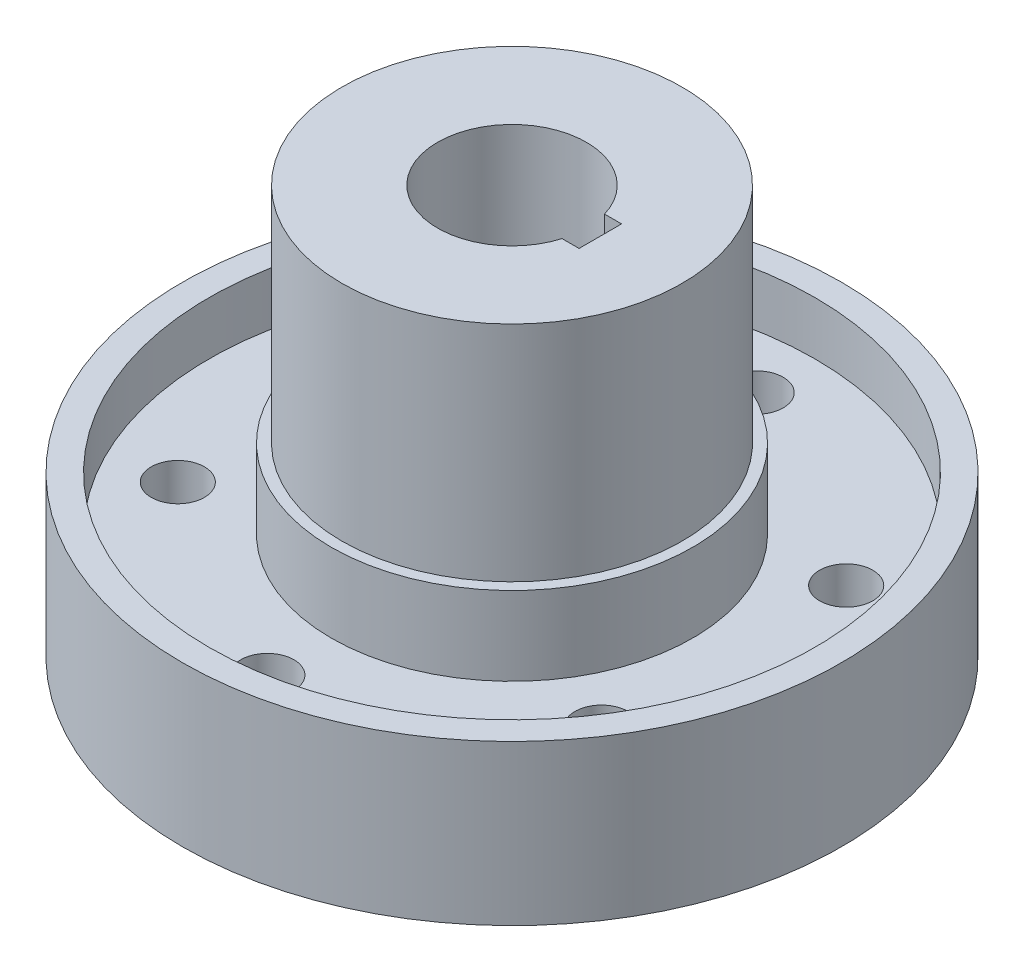
ISO-10303-21;
HEADER;
FILE_DESCRIPTION(('STEP AP214'),'2;1');
FILE_NAME('part.step','',(''),(''),'','','');
FILE_SCHEMA(('AUTOMOTIVE_DESIGN { 1 0 10303 214 1 1 1 1 }'));
ENDSEC;
DATA;
#1=APPLICATION_CONTEXT('core data for automotive mechanical design processes');
#2=APPLICATION_PROTOCOL_DEFINITION('international standard','automotive_design',2000,#1);
#3=PRODUCT_CONTEXT('',#1,'mechanical');
#4=PRODUCT('Part','Part','',(#3));
#5=PRODUCT_RELATED_PRODUCT_CATEGORY('part','',(#4));
#6=PRODUCT_DEFINITION_FORMATION('','',#4);
#7=PRODUCT_DEFINITION_CONTEXT('part definition',#1,'design');
#8=PRODUCT_DEFINITION('design','',#6,#7);
#9=PRODUCT_DEFINITION_SHAPE('','',#8);
#10=(LENGTH_UNIT() NAMED_UNIT(*) SI_UNIT(.MILLI.,.METRE.));
#11=(NAMED_UNIT(*) PLANE_ANGLE_UNIT() SI_UNIT($,.RADIAN.));
#12=(NAMED_UNIT(*) SI_UNIT($,.STERADIAN.) SOLID_ANGLE_UNIT());
#13=UNCERTAINTY_MEASURE_WITH_UNIT(LENGTH_MEASURE(1.E-05),#10,'distance_accuracy_value','');
#14=(GEOMETRIC_REPRESENTATION_CONTEXT(3) GLOBAL_UNCERTAINTY_ASSIGNED_CONTEXT((#13)) GLOBAL_UNIT_ASSIGNED_CONTEXT((#10,
#11,#12)) REPRESENTATION_CONTEXT('',''));
#15=CARTESIAN_POINT('',(0.,0.,0.));
#16=DIRECTION('',(0.,0.,1.));
#17=DIRECTION('',(1.,0.,0.));
#18=AXIS2_PLACEMENT_3D('',#15,#16,#17);
#19=CARTESIAN_POINT('',(0.,0.,0.));
#20=DIRECTION('',(0.,1.,0.));
#21=DIRECTION('',(0.,0.,1.));
#22=AXIS2_PLACEMENT_3D('',#19,#20,#21);
#23=CYLINDRICAL_SURFACE('',#22,35.);
#24=CARTESIAN_POINT('',(0.,53.,0.));
#25=DIRECTION('',(0.,-1.,0.));
#26=DIRECTION('',(0.,0.,-1.));
#27=AXIS2_PLACEMENT_3D('',#24,#25,#26);
#28=CIRCLE('',#27,35.);
#29=CARTESIAN_POINT('',(33.5410196624969,53.,-10.));
#30=VERTEX_POINT('',#29);
#31=CARTESIAN_POINT('',(33.5410196624969,53.,10.));
#32=VERTEX_POINT('',#31);
#33=EDGE_CURVE('E56',#30,#32,#28,.F.);
#34=ORIENTED_EDGE('',*,*,#33,.F.);
#35=DIRECTION('',(0.,1.,0.));
#36=VECTOR('',#35,1.);
#37=CARTESIAN_POINT('',(33.5410196624969,0.,-10.));
#38=LINE('',#37,#36);
#39=CARTESIAN_POINT('',(33.5410196624969,192.,-10.));
#40=VERTEX_POINT('',#39);
#41=EDGE_CURVE('E103',#30,#40,#38,.T.);
#42=ORIENTED_EDGE('',*,*,#41,.T.);
#43=CARTESIAN_POINT('',(0.,192.,0.));
#44=DIRECTION('',(0.,1.,0.));
#45=DIRECTION('',(0.,0.,1.));
#46=AXIS2_PLACEMENT_3D('',#43,#44,#45);
#47=CIRCLE('',#46,35.);
#48=CARTESIAN_POINT('',(33.5410196624969,192.,10.));
#49=VERTEX_POINT('',#48);
#50=EDGE_CURVE('E152',#40,#49,#47,.T.);
#51=ORIENTED_EDGE('',*,*,#50,.T.);
#52=DIRECTION('',(0.,1.,0.));
#53=VECTOR('',#52,1.);
#54=CARTESIAN_POINT('',(33.5410196624969,0.,10.));
#55=LINE('',#54,#53);
#56=EDGE_CURVE('E63',#32,#49,#55,.T.);
#57=ORIENTED_EDGE('',*,*,#56,.F.);
#58=EDGE_LOOP('',(#34,#42,#51,#57));
#59=FACE_BOUND('',#58,.T.);
#60=ADVANCED_FACE('F41',(#59),#23,.F.);
#61=CARTESIAN_POINT('',(33.5410196624969,0.,-10.));
#62=DIRECTION('',(0.,0.,-1.));
#63=DIRECTION('',(-1.,0.,0.));
#64=AXIS2_PLACEMENT_3D('',#61,#62,#63);
#65=PLANE('',#64);
#66=DIRECTION('',(-1.,0.,0.));
#67=VECTOR('',#66,1.);
#68=CARTESIAN_POINT('',(33.5410196624969,53.,-10.));
#69=LINE('',#68,#67);
#70=CARTESIAN_POINT('',(41.5410196624969,53.,-10.));
#71=VERTEX_POINT('',#70);
#72=EDGE_CURVE('E92',#71,#30,#69,.T.);
#73=ORIENTED_EDGE('',*,*,#72,.F.);
#74=DIRECTION('',(0.,1.,0.));
#75=VECTOR('',#74,1.);
#76=CARTESIAN_POINT('',(41.5410196624969,0.,-10.));
#77=LINE('',#76,#75);
#78=CARTESIAN_POINT('',(41.5410196624969,192.,-10.));
#79=VERTEX_POINT('',#78);
#80=EDGE_CURVE('E90',#71,#79,#77,.T.);
#81=ORIENTED_EDGE('',*,*,#80,.T.);
#82=DIRECTION('',(-1.,0.,0.));
#83=VECTOR('',#82,1.);
#84=CARTESIAN_POINT('',(0.,192.,-10.));
#85=LINE('',#84,#83);
#86=EDGE_CURVE('E148',#79,#40,#85,.T.);
#87=ORIENTED_EDGE('',*,*,#86,.T.);
#88=ORIENTED_EDGE('',*,*,#41,.F.);
#89=EDGE_LOOP('',(#73,#81,#87,#88));
#90=FACE_BOUND('',#89,.T.);
#91=ADVANCED_FACE('F179',(#90),#65,.F.);
#92=CARTESIAN_POINT('',(41.5410196624969,0.,-10.));
#93=DIRECTION('',(1.,0.,0.));
#94=DIRECTION('',(0.,0.,-1.));
#95=AXIS2_PLACEMENT_3D('',#92,#93,#94);
#96=PLANE('',#95);
#97=DIRECTION('',(0.,0.,-1.));
#98=VECTOR('',#97,1.);
#99=CARTESIAN_POINT('',(41.5410196624969,53.,-10.));
#100=LINE('',#99,#98);
#101=CARTESIAN_POINT('',(41.5410196624969,53.,10.));
#102=VERTEX_POINT('',#101);
#103=EDGE_CURVE('E82',#102,#71,#100,.T.);
#104=ORIENTED_EDGE('',*,*,#103,.F.);
#105=DIRECTION('',(0.,1.,0.));
#106=VECTOR('',#105,1.);
#107=CARTESIAN_POINT('',(41.5410196624969,0.,10.));
#108=LINE('',#107,#106);
#109=CARTESIAN_POINT('',(41.5410196624969,192.,10.));
#110=VERTEX_POINT('',#109);
#111=EDGE_CURVE('E89',#102,#110,#108,.T.);
#112=ORIENTED_EDGE('',*,*,#111,.T.);
#113=DIRECTION('',(0.,0.,-1.));
#114=VECTOR('',#113,1.);
#115=CARTESIAN_POINT('',(41.5410196624969,192.,0.));
#116=LINE('',#115,#114);
#117=EDGE_CURVE('E145',#110,#79,#116,.T.);
#118=ORIENTED_EDGE('',*,*,#117,.T.);
#119=ORIENTED_EDGE('',*,*,#80,.F.);
#120=EDGE_LOOP('',(#104,#112,#118,#119));
#121=FACE_BOUND('',#120,.T.);
#122=ADVANCED_FACE('F87',(#121),#96,.F.);
#123=CARTESIAN_POINT('',(41.5410196624969,0.,10.));
#124=DIRECTION('',(0.,0.,1.));
#125=DIRECTION('',(1.,0.,0.));
#126=AXIS2_PLACEMENT_3D('',#123,#124,#125);
#127=PLANE('',#126);
#128=DIRECTION('',(1.,0.,0.));
#129=VECTOR('',#128,1.);
#130=CARTESIAN_POINT('',(41.5410196624969,53.,10.));
#131=LINE('',#130,#129);
#132=EDGE_CURVE('E11',#32,#102,#131,.T.);
#133=ORIENTED_EDGE('',*,*,#132,.F.);
#134=ORIENTED_EDGE('',*,*,#56,.T.);
#135=DIRECTION('',(1.,0.,0.));
#136=VECTOR('',#135,1.);
#137=CARTESIAN_POINT('',(0.,192.,10.));
#138=LINE('',#137,#136);
#139=EDGE_CURVE('E97',#49,#110,#138,.T.);
#140=ORIENTED_EDGE('',*,*,#139,.T.);
#141=ORIENTED_EDGE('',*,*,#111,.F.);
#142=EDGE_LOOP('',(#133,#134,#140,#141));
#143=FACE_BOUND('',#142,.T.);
#144=ADVANCED_FACE('F95',(#143),#127,.F.);
#145=CARTESIAN_POINT('',(0.,75.,0.));
#146=DIRECTION('',(0.,-1.,0.));
#147=DIRECTION('',(0.,0.,-1.));
#148=AXIS2_PLACEMENT_3D('',#145,#146,#147);
#149=CYLINDRICAL_SURFACE('',#148,155.);
#150=CARTESIAN_POINT('',(0.,75.,0.));
#151=DIRECTION('',(0.,1.,0.));
#152=DIRECTION('',(0.,0.,1.));
#153=AXIS2_PLACEMENT_3D('',#150,#151,#152);
#154=CIRCLE('',#153,155.);
#155=CARTESIAN_POINT('',(0.,75.,155.));
#156=VERTEX_POINT('',#155);
#157=EDGE_CURVE('E120',#156,#156,#154,.T.);
#158=ORIENTED_EDGE('',*,*,#157,.F.);
#159=EDGE_LOOP('',(#158));
#160=FACE_BOUND('',#159,.T.);
#161=CARTESIAN_POINT('',(0.,0.,0.));
#162=DIRECTION('',(0.,1.,0.));
#163=DIRECTION('',(0.,0.,1.));
#164=AXIS2_PLACEMENT_3D('',#161,#162,#163);
#165=CIRCLE('',#164,155.);
#166=CARTESIAN_POINT('',(0.,0.,155.));
#167=VERTEX_POINT('',#166);
#168=EDGE_CURVE('E133',#167,#167,#165,.T.);
#169=ORIENTED_EDGE('',*,*,#168,.T.);
#170=EDGE_LOOP('',(#169));
#171=FACE_BOUND('',#170,.T.);
#172=ADVANCED_FACE('F43',(#160,#171),#149,.T.);
#173=CARTESIAN_POINT('',(0.,75.,0.));
#174=DIRECTION('',(0.,1.,0.));
#175=DIRECTION('',(0.,0.,1.));
#176=AXIS2_PLACEMENT_3D('',#173,#174,#175);
#177=PLANE('',#176);
#178=CARTESIAN_POINT('',(0.,75.,0.));
#179=DIRECTION('',(0.,1.,0.));
#180=DIRECTION('',(0.,0.,1.));
#181=AXIS2_PLACEMENT_3D('',#178,#179,#180);
#182=CIRCLE('',#181,142.5);
#183=CARTESIAN_POINT('',(0.,75.,142.5));
#184=VERTEX_POINT('',#183);
#185=EDGE_CURVE('E125',#184,#184,#182,.T.);
#186=ORIENTED_EDGE('',*,*,#185,.F.);
#187=EDGE_LOOP('',(#186));
#188=FACE_BOUND('',#187,.T.);
#189=ORIENTED_EDGE('',*,*,#157,.T.);
#190=EDGE_LOOP('',(#189));
#191=FACE_BOUND('',#190,.T.);
#192=ADVANCED_FACE('F164',(#188,#191),#177,.T.);
#193=CARTESIAN_POINT('',(0.,0.,0.));
#194=DIRECTION('',(0.,1.,0.));
#195=DIRECTION('',(0.,0.,1.));
#196=AXIS2_PLACEMENT_3D('',#193,#194,#195);
#197=PLANE('',#196);
#198=CARTESIAN_POINT('',(0.,0.,-115.062551676904));
#199=DIRECTION('',(0.,1.,0.));
#200=DIRECTION('',(0.,0.,1.));
#201=AXIS2_PLACEMENT_3D('',#198,#199,#200);
#202=CIRCLE('',#201,12.5);
#203=CARTESIAN_POINT('',(0.,0.,-102.562551676904));
#204=VERTEX_POINT('',#203);
#205=EDGE_CURVE('E395',#204,#204,#202,.T.);
#206=ORIENTED_EDGE('',*,*,#205,.T.);
#207=EDGE_LOOP('',(#206));
#208=FACE_BOUND('',#207,.T.);
#209=CARTESIAN_POINT('',(-99.6470927764563,0.,-57.5312758384478));
#210=DIRECTION('',(0.,1.,0.));
#211=DIRECTION('',(0.,0.,1.));
#212=AXIS2_PLACEMENT_3D('',#209,#210,#211);
#213=CIRCLE('',#212,12.5000000000049);
#214=CARTESIAN_POINT('',(-99.6470927764563,0.,-45.0312758384429));
#215=VERTEX_POINT('',#214);
#216=EDGE_CURVE('E398',#215,#215,#213,.T.);
#217=ORIENTED_EDGE('',*,*,#216,.T.);
#218=EDGE_LOOP('',(#217));
#219=FACE_BOUND('',#218,.T.);
#220=CARTESIAN_POINT('',(-99.6470927764514,0.,57.5312758384563));
#221=DIRECTION('',(0.,1.,0.));
#222=DIRECTION('',(0.,0.,1.));
#223=AXIS2_PLACEMENT_3D('',#220,#221,#222);
#224=CIRCLE('',#223,12.5000000000093);
#225=CARTESIAN_POINT('',(-99.6470927764514,0.,70.0312758384656));
#226=VERTEX_POINT('',#225);
#227=EDGE_CURVE('E405',#226,#226,#224,.T.);
#228=ORIENTED_EDGE('',*,*,#227,.T.);
#229=EDGE_LOOP('',(#228));
#230=FACE_BOUND('',#229,.T.);
#231=CARTESIAN_POINT('',(9.7632085434102E-12,0.,115.062551676904));
#232=DIRECTION('',(0.,1.,0.));
#233=DIRECTION('',(0.,0.,1.));
#234=AXIS2_PLACEMENT_3D('',#231,#232,#233);
#235=CIRCLE('',#234,12.5000000000101);
#236=CARTESIAN_POINT('',(9.7632085434102E-12,0.,127.562551676914));
#237=VERTEX_POINT('',#236);
#238=EDGE_CURVE('E437',#237,#237,#235,.T.);
#239=ORIENTED_EDGE('',*,*,#238,.T.);
#240=EDGE_LOOP('',(#239));
#241=FACE_BOUND('',#240,.T.);
#242=CARTESIAN_POINT('',(99.6470927764661,0.,57.5312758384478));
#243=DIRECTION('',(0.,1.,0.));
#244=DIRECTION('',(0.,0.,1.));
#245=AXIS2_PLACEMENT_3D('',#242,#243,#244);
#246=CIRCLE('',#245,12.5000000000063);
#247=CARTESIAN_POINT('',(99.6470927764661,0.,70.0312758384541));
#248=VERTEX_POINT('',#247);
#249=EDGE_CURVE('E441',#248,#248,#246,.T.);
#250=ORIENTED_EDGE('',*,*,#249,.T.);
#251=EDGE_LOOP('',(#250));
#252=FACE_BOUND('',#251,.T.);
#253=CARTESIAN_POINT('',(99.6470927764612,0.,-57.5312758384563));
#254=DIRECTION('',(0.,1.,0.));
#255=DIRECTION('',(0.,0.,1.));
#256=AXIS2_PLACEMENT_3D('',#253,#254,#255);
#257=CIRCLE('',#256,12.5000000000014);
#258=CARTESIAN_POINT('',(99.6470927764612,0.,-45.0312758384549));
#259=VERTEX_POINT('',#258);
#260=EDGE_CURVE('E445',#259,#259,#257,.T.);
#261=ORIENTED_EDGE('',*,*,#260,.T.);
#262=EDGE_LOOP('',(#261));
#263=FACE_BOUND('',#262,.T.);
#264=CARTESIAN_POINT('',(0.,0.,0.));
#265=DIRECTION('',(0.,1.,0.));
#266=DIRECTION('',(0.,0.,1.));
#267=AXIS2_PLACEMENT_3D('',#264,#265,#266);
#268=CIRCLE('',#267,75.);
#269=CARTESIAN_POINT('',(0.,0.,75.));
#270=VERTEX_POINT('',#269);
#271=EDGE_CURVE('E50',#270,#270,#268,.F.);
#272=ORIENTED_EDGE('',*,*,#271,.F.);
#273=EDGE_LOOP('',(#272));
#274=FACE_BOUND('',#273,.T.);
#275=ORIENTED_EDGE('',*,*,#168,.F.);
#276=EDGE_LOOP('',(#275));
#277=FACE_BOUND('',#276,.T.);
#278=ADVANCED_FACE('F160',(#208,#219,#230,#241,#252,#263,#274,#277),#197,.F.);
#279=CARTESIAN_POINT('',(0.,50.,0.));
#280=DIRECTION('',(0.,1.,0.));
#281=DIRECTION('',(0.,0.,1.));
#282=AXIS2_PLACEMENT_3D('',#279,#280,#281);
#283=CYLINDRICAL_SURFACE('',#282,142.5);
#284=CARTESIAN_POINT('',(0.,50.,0.));
#285=DIRECTION('',(0.,1.,0.));
#286=DIRECTION('',(0.,0.,1.));
#287=AXIS2_PLACEMENT_3D('',#284,#285,#286);
#288=CIRCLE('',#287,142.5);
#289=CARTESIAN_POINT('',(0.,50.,142.5));
#290=VERTEX_POINT('',#289);
#291=EDGE_CURVE('E129',#290,#290,#288,.T.);
#292=ORIENTED_EDGE('',*,*,#291,.F.);
#293=EDGE_LOOP('',(#292));
#294=FACE_BOUND('',#293,.T.);
#295=ORIENTED_EDGE('',*,*,#185,.T.);
#296=EDGE_LOOP('',(#295));
#297=FACE_BOUND('',#296,.T.);
#298=ADVANCED_FACE('F163',(#294,#297),#283,.F.);
#299=CARTESIAN_POINT('',(0.,50.,0.));
#300=DIRECTION('',(0.,1.,0.));
#301=DIRECTION('',(0.,0.,1.));
#302=AXIS2_PLACEMENT_3D('',#299,#300,#301);
#303=PLANE('',#302);
#304=CARTESIAN_POINT('',(0.,50.,-115.062551676904));
#305=DIRECTION('',(0.,1.,0.));
#306=DIRECTION('',(0.,0.,1.));
#307=AXIS2_PLACEMENT_3D('',#304,#305,#306);
#308=CIRCLE('',#307,12.5);
#309=CARTESIAN_POINT('',(0.,50.,-102.562551676904));
#310=VERTEX_POINT('',#309);
#311=EDGE_CURVE('E392',#310,#310,#308,.T.);
#312=ORIENTED_EDGE('',*,*,#311,.F.);
#313=EDGE_LOOP('',(#312));
#314=FACE_BOUND('',#313,.T.);
#315=CARTESIAN_POINT('',(-99.6470927764563,50.,-57.5312758384478));
#316=DIRECTION('',(0.,1.,0.));
#317=DIRECTION('',(0.,0.,1.));
#318=AXIS2_PLACEMENT_3D('',#315,#316,#317);
#319=CIRCLE('',#318,12.5000000000049);
#320=CARTESIAN_POINT('',(-99.6470927764563,50.,-45.0312758384429));
#321=VERTEX_POINT('',#320);
#322=EDGE_CURVE('E454',#321,#321,#319,.T.);
#323=ORIENTED_EDGE('',*,*,#322,.F.);
#324=EDGE_LOOP('',(#323));
#325=FACE_BOUND('',#324,.T.);
#326=CARTESIAN_POINT('',(-99.6470927764514,50.,57.5312758384563));
#327=DIRECTION('',(0.,1.,0.));
#328=DIRECTION('',(0.,0.,1.));
#329=AXIS2_PLACEMENT_3D('',#326,#327,#328);
#330=CIRCLE('',#329,12.5000000000093);
#331=CARTESIAN_POINT('',(-99.6470927764514,50.,70.0312758384656));
#332=VERTEX_POINT('',#331);
#333=EDGE_CURVE('E449',#332,#332,#330,.T.);
#334=ORIENTED_EDGE('',*,*,#333,.F.);
#335=EDGE_LOOP('',(#334));
#336=FACE_BOUND('',#335,.T.);
#337=CARTESIAN_POINT('',(9.7632085434102E-12,50.,115.062551676904));
#338=DIRECTION('',(0.,1.,0.));
#339=DIRECTION('',(0.,0.,1.));
#340=AXIS2_PLACEMENT_3D('',#337,#338,#339);
#341=CIRCLE('',#340,12.5000000000101);
#342=CARTESIAN_POINT('',(9.7632085434102E-12,50.,127.562551676914));
#343=VERTEX_POINT('',#342);
#344=EDGE_CURVE('E453',#343,#343,#341,.T.);
#345=ORIENTED_EDGE('',*,*,#344,.F.);
#346=EDGE_LOOP('',(#345));
#347=FACE_BOUND('',#346,.T.);
#348=CARTESIAN_POINT('',(99.6470927764661,50.,57.5312758384478));
#349=DIRECTION('',(0.,1.,0.));
#350=DIRECTION('',(0.,0.,1.));
#351=AXIS2_PLACEMENT_3D('',#348,#349,#350);
#352=CIRCLE('',#351,12.5000000000063);
#353=CARTESIAN_POINT('',(99.6470927764661,50.,70.0312758384541));
#354=VERTEX_POINT('',#353);
#355=EDGE_CURVE('E458',#354,#354,#352,.T.);
#356=ORIENTED_EDGE('',*,*,#355,.F.);
#357=EDGE_LOOP('',(#356));
#358=FACE_BOUND('',#357,.T.);
#359=CARTESIAN_POINT('',(99.6470927764612,50.,-57.5312758384563));
#360=DIRECTION('',(0.,1.,0.));
#361=DIRECTION('',(0.,0.,1.));
#362=AXIS2_PLACEMENT_3D('',#359,#360,#361);
#363=CIRCLE('',#362,12.5000000000014);
#364=CARTESIAN_POINT('',(99.6470927764612,50.,-45.0312758384549));
#365=VERTEX_POINT('',#364);
#366=EDGE_CURVE('E462',#365,#365,#363,.T.);
#367=ORIENTED_EDGE('',*,*,#366,.F.);
#368=EDGE_LOOP('',(#367));
#369=FACE_BOUND('',#368,.T.);
#370=CARTESIAN_POINT('',(0.,50.,0.));
#371=DIRECTION('',(0.,1.,0.));
#372=DIRECTION('',(0.,0.,1.));
#373=AXIS2_PLACEMENT_3D('',#370,#371,#372);
#374=CIRCLE('',#373,85.);
#375=CARTESIAN_POINT('',(0.,50.,85.));
#376=VERTEX_POINT('',#375);
#377=EDGE_CURVE('E115',#376,#376,#374,.T.);
#378=ORIENTED_EDGE('',*,*,#377,.F.);
#379=EDGE_LOOP('',(#378));
#380=FACE_BOUND('',#379,.T.);
#381=ORIENTED_EDGE('',*,*,#291,.T.);
#382=EDGE_LOOP('',(#381));
#383=FACE_BOUND('',#382,.T.);
#384=ADVANCED_FACE('F204',(#314,#325,#336,#347,#358,#369,#380,#383),#303,.T.);
#385=CARTESIAN_POINT('',(0.,87.,0.));
#386=DIRECTION('',(0.,-1.,0.));
#387=DIRECTION('',(0.,0.,-1.));
#388=AXIS2_PLACEMENT_3D('',#385,#386,#387);
#389=CYLINDRICAL_SURFACE('',#388,85.);
#390=CARTESIAN_POINT('',(0.,87.,0.));
#391=DIRECTION('',(0.,1.,0.));
#392=DIRECTION('',(0.,0.,1.));
#393=AXIS2_PLACEMENT_3D('',#390,#391,#392);
#394=CIRCLE('',#393,85.);
#395=CARTESIAN_POINT('',(0.,87.,85.));
#396=VERTEX_POINT('',#395);
#397=EDGE_CURVE('E121',#396,#396,#394,.T.);
#398=ORIENTED_EDGE('',*,*,#397,.F.);
#399=EDGE_LOOP('',(#398));
#400=FACE_BOUND('',#399,.T.);
#401=ORIENTED_EDGE('',*,*,#377,.T.);
#402=EDGE_LOOP('',(#401));
#403=FACE_BOUND('',#402,.T.);
#404=ADVANCED_FACE('F200',(#400,#403),#389,.T.);
#405=CARTESIAN_POINT('',(0.,87.,0.));
#406=DIRECTION('',(0.,1.,0.));
#407=DIRECTION('',(0.,0.,1.));
#408=AXIS2_PLACEMENT_3D('',#405,#406,#407);
#409=PLANE('',#408);
#410=CARTESIAN_POINT('',(0.,87.,0.));
#411=DIRECTION('',(0.,1.,0.));
#412=DIRECTION('',(0.,0.,1.));
#413=AXIS2_PLACEMENT_3D('',#410,#411,#412);
#414=CIRCLE('',#413,80.);
#415=CARTESIAN_POINT('',(0.,87.,80.));
#416=VERTEX_POINT('',#415);
#417=EDGE_CURVE('E116',#416,#416,#414,.T.);
#418=ORIENTED_EDGE('',*,*,#417,.F.);
#419=EDGE_LOOP('',(#418));
#420=FACE_BOUND('',#419,.T.);
#421=ORIENTED_EDGE('',*,*,#397,.T.);
#422=EDGE_LOOP('',(#421));
#423=FACE_BOUND('',#422,.T.);
#424=ADVANCED_FACE('F196',(#420,#423),#409,.T.);
#425=CARTESIAN_POINT('',(0.,192.,0.));
#426=DIRECTION('',(0.,-1.,0.));
#427=DIRECTION('',(0.,0.,-1.));
#428=AXIS2_PLACEMENT_3D('',#425,#426,#427);
#429=CYLINDRICAL_SURFACE('',#428,80.);
#430=CARTESIAN_POINT('',(0.,192.,0.));
#431=DIRECTION('',(0.,1.,0.));
#432=DIRECTION('',(0.,0.,1.));
#433=AXIS2_PLACEMENT_3D('',#430,#431,#432);
#434=CIRCLE('',#433,80.);
#435=CARTESIAN_POINT('',(0.,192.,80.));
#436=VERTEX_POINT('',#435);
#437=EDGE_CURVE('E110',#436,#436,#434,.T.);
#438=ORIENTED_EDGE('',*,*,#437,.F.);
#439=EDGE_LOOP('',(#438));
#440=FACE_BOUND('',#439,.T.);
#441=ORIENTED_EDGE('',*,*,#417,.T.);
#442=EDGE_LOOP('',(#441));
#443=FACE_BOUND('',#442,.T.);
#444=ADVANCED_FACE('F192',(#440,#443),#429,.T.);
#445=CARTESIAN_POINT('',(0.,192.,0.));
#446=DIRECTION('',(0.,1.,0.));
#447=DIRECTION('',(0.,0.,1.));
#448=AXIS2_PLACEMENT_3D('',#445,#446,#447);
#449=PLANE('',#448);
#450=ORIENTED_EDGE('',*,*,#50,.F.);
#451=ORIENTED_EDGE('',*,*,#86,.F.);
#452=ORIENTED_EDGE('',*,*,#117,.F.);
#453=ORIENTED_EDGE('',*,*,#139,.F.);
#454=EDGE_LOOP('',(#450,#451,#452,#453));
#455=FACE_BOUND('',#454,.T.);
#456=ORIENTED_EDGE('',*,*,#437,.T.);
#457=EDGE_LOOP('',(#456));
#458=FACE_BOUND('',#457,.T.);
#459=ADVANCED_FACE('F189',(#455,#458),#449,.T.);
#460=CARTESIAN_POINT('',(0.,-5.,0.));
#461=DIRECTION('',(0.,1.,0.));
#462=DIRECTION('',(0.,0.,1.));
#463=AXIS2_PLACEMENT_3D('',#460,#461,#462);
#464=CYLINDRICAL_SURFACE('',#463,75.);
#465=CARTESIAN_POINT('',(0.,-5.,0.));
#466=DIRECTION('',(0.,-1.,0.));
#467=DIRECTION('',(0.,0.,-1.));
#468=AXIS2_PLACEMENT_3D('',#465,#466,#467);
#469=CIRCLE('',#468,75.);
#470=CARTESIAN_POINT('',(0.,-5.,-75.));
#471=VERTEX_POINT('',#470);
#472=EDGE_CURVE('E105',#471,#471,#469,.T.);
#473=ORIENTED_EDGE('',*,*,#472,.F.);
#474=EDGE_LOOP('',(#473));
#475=FACE_BOUND('',#474,.T.);
#476=ORIENTED_EDGE('',*,*,#271,.T.);
#477=EDGE_LOOP('',(#476));
#478=FACE_BOUND('',#477,.T.);
#479=ADVANCED_FACE('F158',(#475,#478),#464,.T.);
#480=CARTESIAN_POINT('',(0.,-5.,0.));
#481=DIRECTION('',(0.,-1.,0.));
#482=DIRECTION('',(0.,0.,-1.));
#483=AXIS2_PLACEMENT_3D('',#480,#481,#482);
#484=PLANE('',#483);
#485=CARTESIAN_POINT('',(0.,-5.,0.));
#486=DIRECTION('',(0.,-1.,0.));
#487=DIRECTION('',(0.,0.,-1.));
#488=AXIS2_PLACEMENT_3D('',#485,#486,#487);
#489=CIRCLE('',#488,60.);
#490=CARTESIAN_POINT('',(0.,-5.,-60.));
#491=VERTEX_POINT('',#490);
#492=EDGE_CURVE('E397',#491,#491,#489,.T.);
#493=ORIENTED_EDGE('',*,*,#492,.F.);
#494=EDGE_LOOP('',(#493));
#495=FACE_BOUND('',#494,.T.);
#496=ORIENTED_EDGE('',*,*,#472,.T.);
#497=EDGE_LOOP('',(#496));
#498=FACE_BOUND('',#497,.T.);
#499=ADVANCED_FACE('F248',(#495,#498),#484,.T.);
#500=CARTESIAN_POINT('',(0.,53.,0.));
#501=DIRECTION('',(0.,-1.,0.));
#502=DIRECTION('',(0.,0.,-1.));
#503=AXIS2_PLACEMENT_3D('',#500,#501,#502);
#504=PLANE('',#503);
#505=CARTESIAN_POINT('',(0.,53.,0.));
#506=DIRECTION('',(0.,-1.,0.));
#507=DIRECTION('',(0.,0.,-1.));
#508=AXIS2_PLACEMENT_3D('',#505,#506,#507);
#509=CIRCLE('',#508,60.);
#510=CARTESIAN_POINT('',(0.,53.,-60.));
#511=VERTEX_POINT('',#510);
#512=EDGE_CURVE('E93',#511,#511,#509,.T.);
#513=ORIENTED_EDGE('',*,*,#512,.T.);
#514=EDGE_LOOP('',(#513));
#515=FACE_BOUND('',#514,.T.);
#516=ORIENTED_EDGE('',*,*,#33,.T.);
#517=ORIENTED_EDGE('',*,*,#132,.T.);
#518=ORIENTED_EDGE('',*,*,#103,.T.);
#519=ORIENTED_EDGE('',*,*,#72,.T.);
#520=EDGE_LOOP('',(#516,#517,#518,#519));
#521=FACE_BOUND('',#520,.T.);
#522=ADVANCED_FACE('F81',(#515,#521),#504,.T.);
#523=CARTESIAN_POINT('',(0.,53.,0.));
#524=DIRECTION('',(0.,-1.,0.));
#525=DIRECTION('',(0.,0.,-1.));
#526=AXIS2_PLACEMENT_3D('',#523,#524,#525);
#527=CYLINDRICAL_SURFACE('',#526,60.);
#528=CARTESIAN_POINT('',(0.,53.,-60.));
#529=CARTESIAN_POINT('',(0.,52.3958333333333,-60.));
#530=CARTESIAN_POINT('',(0.,51.7916666666667,-60.));
#531=CARTESIAN_POINT('',(0.,50.5833333333333,-60.));
#532=CARTESIAN_POINT('',(0.,49.9791666666667,-60.));
#533=CARTESIAN_POINT('',(0.,48.7708333333333,-60.));
#534=CARTESIAN_POINT('',(0.,48.1666666666667,-60.));
#535=CARTESIAN_POINT('',(0.,46.9583333333333,-60.));
#536=CARTESIAN_POINT('',(0.,46.3541666666667,-60.));
#537=CARTESIAN_POINT('',(0.,45.1458333333333,-60.));
#538=CARTESIAN_POINT('',(0.,44.5416666666667,-60.));
#539=CARTESIAN_POINT('',(0.,43.3333333333333,-60.));
#540=CARTESIAN_POINT('',(0.,42.7291666666667,-60.));
#541=CARTESIAN_POINT('',(0.,41.5208333333333,-60.));
#542=CARTESIAN_POINT('',(0.,40.9166666666667,-60.));
#543=CARTESIAN_POINT('',(0.,39.7083333333333,-60.));
#544=CARTESIAN_POINT('',(0.,39.1041666666667,-60.));
#545=CARTESIAN_POINT('',(0.,37.8958333333333,-60.));
#546=CARTESIAN_POINT('',(0.,37.2916666666667,-60.));
#547=CARTESIAN_POINT('',(0.,36.0833333333333,-60.));
#548=CARTESIAN_POINT('',(0.,35.4791666666667,-60.));
#549=CARTESIAN_POINT('',(0.,34.2708333333333,-60.));
#550=CARTESIAN_POINT('',(0.,33.6666666666667,-60.));
#551=CARTESIAN_POINT('',(0.,32.4583333333333,-60.));
#552=CARTESIAN_POINT('',(0.,31.8541666666667,-60.));
#553=CARTESIAN_POINT('',(0.,30.6458333333333,-60.));
#554=CARTESIAN_POINT('',(0.,30.0416666666667,-60.));
#555=CARTESIAN_POINT('',(0.,28.8333333333333,-60.));
#556=CARTESIAN_POINT('',(0.,28.2291666666667,-60.));
#557=CARTESIAN_POINT('',(0.,27.0208333333333,-60.));
#558=CARTESIAN_POINT('',(0.,26.4166666666667,-60.));
#559=CARTESIAN_POINT('',(0.,25.2083333333333,-60.));
#560=CARTESIAN_POINT('',(0.,24.6041666666667,-60.));
#561=CARTESIAN_POINT('',(0.,23.3958333333333,-60.));
#562=CARTESIAN_POINT('',(0.,22.7916666666667,-60.));
#563=CARTESIAN_POINT('',(0.,21.5833333333333,-60.));
#564=CARTESIAN_POINT('',(0.,20.9791666666667,-60.));
#565=CARTESIAN_POINT('',(0.,19.7708333333333,-60.));
#566=CARTESIAN_POINT('',(0.,19.1666666666667,-60.));
#567=CARTESIAN_POINT('',(0.,17.9583333333333,-60.));
#568=CARTESIAN_POINT('',(0.,17.3541666666667,-60.));
#569=CARTESIAN_POINT('',(0.,16.1458333333333,-60.));
#570=CARTESIAN_POINT('',(0.,15.5416666666667,-60.));
#571=CARTESIAN_POINT('',(0.,14.3333333333333,-60.));
#572=CARTESIAN_POINT('',(0.,13.7291666666667,-60.));
#573=CARTESIAN_POINT('',(0.,12.5208333333333,-60.));
#574=CARTESIAN_POINT('',(0.,11.9166666666667,-60.));
#575=CARTESIAN_POINT('',(0.,10.7083333333333,-60.));
#576=CARTESIAN_POINT('',(0.,10.1041666666667,-60.));
#577=CARTESIAN_POINT('',(0.,8.89583333333334,-60.));
#578=CARTESIAN_POINT('',(0.,8.29166666666667,-60.));
#579=CARTESIAN_POINT('',(0.,7.08333333333334,-60.));
#580=CARTESIAN_POINT('',(0.,6.47916666666667,-60.));
#581=CARTESIAN_POINT('',(0.,5.27083333333334,-60.));
#582=CARTESIAN_POINT('',(0.,4.66666666666667,-60.));
#583=CARTESIAN_POINT('',(0.,3.45833333333334,-60.));
#584=CARTESIAN_POINT('',(0.,2.85416666666667,-60.));
#585=CARTESIAN_POINT('',(0.,1.64583333333333,-60.));
#586=CARTESIAN_POINT('',(0.,1.04166666666667,-60.));
#587=CARTESIAN_POINT('',(0.,-0.166666666666664,-60.));
#588=CARTESIAN_POINT('',(0.,-0.770833333333329,-60.));
#589=CARTESIAN_POINT('',(0.,-1.97916666666666,-60.));
#590=CARTESIAN_POINT('',(0.,-2.58333333333333,-60.));
#591=CARTESIAN_POINT('',(0.,-3.79166666666666,-60.));
#592=CARTESIAN_POINT('',(0.,-4.39583333333333,-60.));
#593=CARTESIAN_POINT('',(0.,-5.,-60.));
#594=B_SPLINE_CURVE_WITH_KNOTS('',3,(#528,#529,#530,#531,#532,#533,#534,#535,#536,#537,#538,
#539,#540,#541,#542,#543,#544,#545,#546,#547,#548,#549,#550,#551,#552,#553,#554,#555,#556,#557,
#558,#559,#560,#561,#562,#563,#564,#565,#566,#567,#568,#569,#570,#571,#572,#573,#574,#575,#576,
#577,#578,#579,#580,#581,#582,#583,#584,#585,#586,#587,#588,#589,#590,#591,#592,#593),
.UNSPECIFIED.,.F.,.F.,(4,2,2,2,2,2,2,2,2,2,2,2,2,2,2,2,2,2,2,2,2,2,2,2,2,2,2,2,2,2,2,2,4),(0.,
1.81249999999999,3.625,5.4375,7.25,9.06249999999999,10.875,12.6875,14.5,16.3125,18.125,19.9375,
21.75,23.5625,25.375,27.1875,29.,30.8125,32.625,34.4375,36.25,38.0625,39.875,41.6875,43.5,
45.3125,47.125,48.9375,50.75,52.5625,54.375,56.1875,58.),.UNSPECIFIED.);
#595=EDGE_CURVE('BSEAM264',#511,#491,#594,.T.);
#596=ORIENTED_EDGE('',*,*,#512,.F.);
#597=ORIENTED_EDGE('',*,*,#492,.T.);
#598=ORIENTED_EDGE('',*,*,#595,.T.);
#599=ORIENTED_EDGE('',*,*,#595,.F.);
#600=EDGE_LOOP('',(#596,#598,#597,#599));
#601=FACE_BOUND('',#600,.T.);
#602=ADVANCED_FACE('F264',(#601),#527,.F.);
#603=CARTESIAN_POINT('',(99.6470927764612,-5.,-57.5312758384563));
#604=DIRECTION('',(0.,1.,0.));
#605=DIRECTION('',(0.,0.,1.));
#606=AXIS2_PLACEMENT_3D('',#603,#604,#605);
#607=CYLINDRICAL_SURFACE('',#606,12.5000000000014);
#608=ORIENTED_EDGE('',*,*,#366,.T.);
#609=EDGE_LOOP('',(#608));
#610=FACE_BOUND('',#609,.T.);
#611=ORIENTED_EDGE('',*,*,#260,.F.);
#612=EDGE_LOOP('',(#611));
#613=FACE_BOUND('',#612,.T.);
#614=ADVANCED_FACE('F272',(#610,#613),#607,.F.);
#615=CARTESIAN_POINT('',(99.6470927764661,-5.,57.5312758384478));
#616=DIRECTION('',(0.,1.,0.));
#617=DIRECTION('',(0.,0.,1.));
#618=AXIS2_PLACEMENT_3D('',#615,#616,#617);
#619=CYLINDRICAL_SURFACE('',#618,12.5000000000063);
#620=ORIENTED_EDGE('',*,*,#355,.T.);
#621=EDGE_LOOP('',(#620));
#622=FACE_BOUND('',#621,.T.);
#623=ORIENTED_EDGE('',*,*,#249,.F.);
#624=EDGE_LOOP('',(#623));
#625=FACE_BOUND('',#624,.T.);
#626=ADVANCED_FACE('F279',(#622,#625),#619,.F.);
#627=CARTESIAN_POINT('',(9.7632085434102E-12,-5.,115.062551676904));
#628=DIRECTION('',(0.,1.,0.));
#629=DIRECTION('',(0.,0.,1.));
#630=AXIS2_PLACEMENT_3D('',#627,#628,#629);
#631=CYLINDRICAL_SURFACE('',#630,12.5000000000101);
#632=ORIENTED_EDGE('',*,*,#344,.T.);
#633=EDGE_LOOP('',(#632));
#634=FACE_BOUND('',#633,.T.);
#635=ORIENTED_EDGE('',*,*,#238,.F.);
#636=EDGE_LOOP('',(#635));
#637=FACE_BOUND('',#636,.T.);
#638=ADVANCED_FACE('F287',(#634,#637),#631,.F.);
#639=CARTESIAN_POINT('',(-99.6470927764514,-5.,57.5312758384563));
#640=DIRECTION('',(0.,1.,0.));
#641=DIRECTION('',(0.,0.,1.));
#642=AXIS2_PLACEMENT_3D('',#639,#640,#641);
#643=CYLINDRICAL_SURFACE('',#642,12.5000000000093);
#644=ORIENTED_EDGE('',*,*,#333,.T.);
#645=EDGE_LOOP('',(#644));
#646=FACE_BOUND('',#645,.T.);
#647=ORIENTED_EDGE('',*,*,#227,.F.);
#648=EDGE_LOOP('',(#647));
#649=FACE_BOUND('',#648,.T.);
#650=ADVANCED_FACE('F295',(#646,#649),#643,.F.);
#651=CARTESIAN_POINT('',(-99.6470927764563,-5.,-57.5312758384478));
#652=DIRECTION('',(0.,1.,0.));
#653=DIRECTION('',(0.,0.,1.));
#654=AXIS2_PLACEMENT_3D('',#651,#652,#653);
#655=CYLINDRICAL_SURFACE('',#654,12.5000000000049);
#656=ORIENTED_EDGE('',*,*,#322,.T.);
#657=EDGE_LOOP('',(#656));
#658=FACE_BOUND('',#657,.T.);
#659=ORIENTED_EDGE('',*,*,#216,.F.);
#660=EDGE_LOOP('',(#659));
#661=FACE_BOUND('',#660,.T.);
#662=ADVANCED_FACE('F303',(#658,#661),#655,.F.);
#663=CARTESIAN_POINT('',(0.,-5.,-115.062551676904));
#664=DIRECTION('',(0.,1.,0.));
#665=DIRECTION('',(0.,0.,1.));
#666=AXIS2_PLACEMENT_3D('',#663,#664,#665);
#667=CYLINDRICAL_SURFACE('',#666,12.5);
#668=ORIENTED_EDGE('',*,*,#311,.T.);
#669=EDGE_LOOP('',(#668));
#670=FACE_BOUND('',#669,.T.);
#671=ORIENTED_EDGE('',*,*,#205,.F.);
#672=EDGE_LOOP('',(#671));
#673=FACE_BOUND('',#672,.T.);
#674=ADVANCED_FACE('F311',(#670,#673),#667,.F.);
#675=CLOSED_SHELL('',(#60,#91,#122,#144,#172,#192,#278,#298,#384,#404,#424,#444,#459,#479,#499,
#522,#602,#614,#626,#638,#650,#662,#674));
#676=MANIFOLD_SOLID_BREP('B2',#675);
#677=ADVANCED_BREP_SHAPE_REPRESENTATION('',(#18,#676),#14);
#678=SHAPE_DEFINITION_REPRESENTATION(#9,#677);
ENDSEC;
END-ISO-10303-21;
